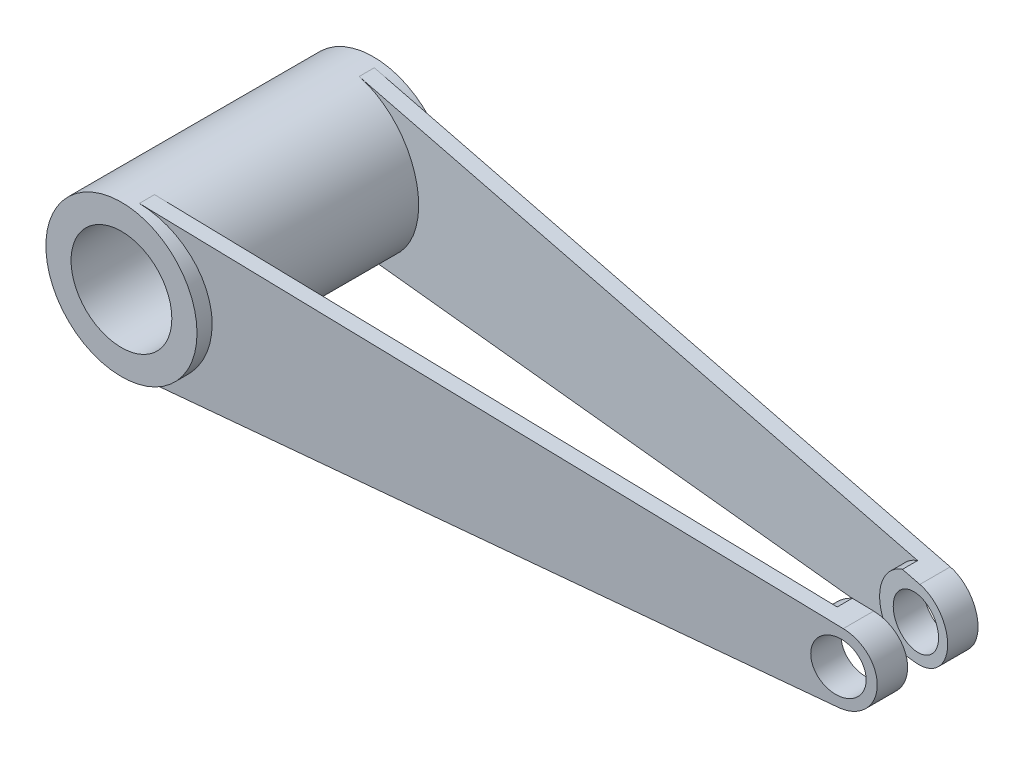
ISO-10303-21;
HEADER;
FILE_DESCRIPTION(('STEP AP214'),'2;1');
FILE_NAME('part.step','',(''),(''),'','','');
FILE_SCHEMA(('AUTOMOTIVE_DESIGN { 1 0 10303 214 1 1 1 1 }'));
ENDSEC;
DATA;
#1=APPLICATION_CONTEXT('core data for automotive mechanical design processes');
#2=APPLICATION_PROTOCOL_DEFINITION('international standard','automotive_design',2000,#1);
#3=PRODUCT_CONTEXT('',#1,'mechanical');
#4=PRODUCT('Part','Part','',(#3));
#5=PRODUCT_RELATED_PRODUCT_CATEGORY('part','',(#4));
#6=PRODUCT_DEFINITION_FORMATION('','',#4);
#7=PRODUCT_DEFINITION_CONTEXT('part definition',#1,'design');
#8=PRODUCT_DEFINITION('design','',#6,#7);
#9=PRODUCT_DEFINITION_SHAPE('','',#8);
#10=(LENGTH_UNIT() NAMED_UNIT(*) SI_UNIT(.MILLI.,.METRE.));
#11=(NAMED_UNIT(*) PLANE_ANGLE_UNIT() SI_UNIT($,.RADIAN.));
#12=(NAMED_UNIT(*) SI_UNIT($,.STERADIAN.) SOLID_ANGLE_UNIT());
#13=UNCERTAINTY_MEASURE_WITH_UNIT(LENGTH_MEASURE(1.E-05),#10,'distance_accuracy_value','');
#14=(GEOMETRIC_REPRESENTATION_CONTEXT(3) GLOBAL_UNCERTAINTY_ASSIGNED_CONTEXT((#13)) GLOBAL_UNIT_ASSIGNED_CONTEXT((#10,
#11,#12)) REPRESENTATION_CONTEXT('',''));
#15=CARTESIAN_POINT('',(0.,0.,0.));
#16=DIRECTION('',(0.,0.,1.));
#17=DIRECTION('',(1.,0.,0.));
#18=AXIS2_PLACEMENT_3D('',#15,#16,#17);
#19=CARTESIAN_POINT('',(0.,0.,0.));
#20=DIRECTION('',(0.,1.,0.));
#21=DIRECTION('',(0.,0.,1.));
#22=AXIS2_PLACEMENT_3D('',#19,#20,#21);
#23=PLANE('',#22);
#24=DIRECTION('',(-0.995037190209989,0.,-0.0995037190209985));
#25=VECTOR('',#24,1.);
#26=CARTESIAN_POINT('',(154.700746273275,0.,-3.50000000000005));
#27=LINE('',#26,#25);
#28=CARTESIAN_POINT('',(143.,0.,-4.67007462732751));
#29=VERTEX_POINT('',#28);
#30=CARTESIAN_POINT('',(139.127016653793,0.,-5.05737296194825));
#31=VERTEX_POINT('',#30);
#32=EDGE_CURVE('E242',#29,#31,#27,.T.);
#33=ORIENTED_EDGE('',*,*,#32,.T.);
#34=DIRECTION('',(0.,0.,1.));
#35=VECTOR('',#34,1.);
#36=CARTESIAN_POINT('',(139.127016653793,0.,-25.));
#37=LINE('',#36,#35);
#38=CARTESIAN_POINT('',(139.127016653793,0.,-8.07233564828452));
#39=VERTEX_POINT('',#38);
#40=EDGE_CURVE('E306',#39,#31,#37,.T.);
#41=ORIENTED_EDGE('',*,*,#40,.F.);
#42=DIRECTION('',(-0.995037190209989,0.,-0.0995037190209987));
#43=VECTOR('',#42,1.);
#44=CARTESIAN_POINT('',(149.701488842937,0.,-7.01488842937008));
#45=LINE('',#44,#43);
#46=CARTESIAN_POINT('',(15.,0.,-20.4850373136637));
#47=VERTEX_POINT('',#46);
#48=EDGE_CURVE('E358',#39,#47,#45,.T.);
#49=ORIENTED_EDGE('',*,*,#48,.T.);
#50=DIRECTION('',(0.,0.,1.));
#51=VECTOR('',#50,1.);
#52=CARTESIAN_POINT('',(15.,0.,-25.));
#53=LINE('',#52,#51);
#54=CARTESIAN_POINT('',(15.,0.,-23.5));
#55=VERTEX_POINT('',#54);
#56=EDGE_CURVE('E265',#47,#55,#53,.F.);
#57=ORIENTED_EDGE('',*,*,#56,.T.);
#58=DIRECTION('',(-0.995037190209989,0.,-0.0995037190209986));
#59=VECTOR('',#58,1.);
#60=CARTESIAN_POINT('',(150.,0.,-10.));
#61=LINE('',#60,#59);
#62=CARTESIAN_POINT('',(143.,0.,-10.7));
#63=VERTEX_POINT('',#62);
#64=EDGE_CURVE('E264',#63,#55,#61,.T.);
#65=ORIENTED_EDGE('',*,*,#64,.F.);
#66=DIRECTION('',(0.,0.,1.));
#67=VECTOR('',#66,1.);
#68=CARTESIAN_POINT('',(143.,0.,-25.));
#69=LINE('',#68,#67);
#70=EDGE_CURVE('E256',#63,#29,#69,.T.);
#71=ORIENTED_EDGE('',*,*,#70,.T.);
#72=EDGE_LOOP('',(#33,#41,#49,#57,#65,#71));
#73=FACE_BOUND('',#72,.T.);
#74=ADVANCED_FACE('F155',(#73),#23,.F.);
#75=DIRECTION('',(0.995037190209989,0.,-0.0995037190209992));
#76=VECTOR('',#75,1.);
#77=CARTESIAN_POINT('',(154.700746273275,0.,3.49999999999995));
#78=LINE('',#77,#76);
#79=CARTESIAN_POINT('',(139.127016653793,0.,5.05737296194816));
#80=VERTEX_POINT('',#79);
#81=CARTESIAN_POINT('',(143.,0.,4.67007462732742));
#82=VERTEX_POINT('',#81);
#83=EDGE_CURVE('E251',#80,#82,#78,.T.);
#84=ORIENTED_EDGE('',*,*,#83,.T.);
#85=CARTESIAN_POINT('',(143.,0.,10.7));
#86=VERTEX_POINT('',#85);
#87=EDGE_CURVE('E266',#82,#86,#69,.T.);
#88=ORIENTED_EDGE('',*,*,#87,.T.);
#89=DIRECTION('',(0.995037190209989,0.,-0.0995037190209992));
#90=VECTOR('',#89,1.);
#91=CARTESIAN_POINT('',(0.,0.,25.));
#92=LINE('',#91,#90);
#93=CARTESIAN_POINT('',(15.,0.,23.5));
#94=VERTEX_POINT('',#93);
#95=EDGE_CURVE('E326',#94,#86,#92,.T.);
#96=ORIENTED_EDGE('',*,*,#95,.F.);
#97=CARTESIAN_POINT('',(15.,0.,20.4850373136637));
#98=VERTEX_POINT('',#97);
#99=EDGE_CURVE('E268',#94,#98,#53,.F.);
#100=ORIENTED_EDGE('',*,*,#99,.T.);
#101=DIRECTION('',(0.995037190209989,0.,-0.0995037190209992));
#102=VECTOR('',#101,1.);
#103=CARTESIAN_POINT('',(-0.298511157062994,0.,22.01488842937));
#104=LINE('',#103,#102);
#105=CARTESIAN_POINT('',(139.127016653793,0.,8.07233564828443));
#106=VERTEX_POINT('',#105);
#107=EDGE_CURVE('E305',#98,#106,#104,.T.);
#108=ORIENTED_EDGE('',*,*,#107,.T.);
#109=EDGE_CURVE('E289',#80,#106,#37,.T.);
#110=ORIENTED_EDGE('',*,*,#109,.F.);
#111=EDGE_LOOP('',(#84,#88,#96,#100,#108,#110));
#112=FACE_BOUND('',#111,.T.);
#113=ADVANCED_FACE('F304',(#112),#23,.F.);
#114=CARTESIAN_POINT('',(143.,7.,-25.));
#115=DIRECTION('',(0.,0.,1.));
#116=DIRECTION('',(1.,0.,0.));
#117=AXIS2_PLACEMENT_3D('',#114,#115,#116);
#118=CYLINDRICAL_SURFACE('',#117,7.00000000000002);
#119=DIRECTION('',(0.,0.,1.));
#120=VECTOR('',#119,1.);
#121=CARTESIAN_POINT('',(143.871595330739,13.9455252918288,-25.));
#122=LINE('',#121,#120);
#123=CARTESIAN_POINT('',(143.871595330739,13.9455252918288,-10.6128404669261));
#124=VERTEX_POINT('',#123);
#125=CARTESIAN_POINT('',(143.871595330739,13.9455252918288,-4.58291509425358));
#126=VERTEX_POINT('',#125);
#127=EDGE_CURVE('E259',#124,#126,#122,.T.);
#128=ORIENTED_EDGE('',*,*,#127,.T.);
#129=CARTESIAN_POINT('',(143.,7.,-4.67007462732751));
#130=DIRECTION('',(-0.0995037190209985,0.,0.995037190209989));
#131=DIRECTION('',(0.995037190209989,0.,0.0995037190209985));
#132=AXIS2_PLACEMENT_3D('',#129,#130,#131);
#133=ELLIPSE('',#132,7.03491293478464,7.00000000000002);
#134=EDGE_CURVE('E246',#126,#29,#133,.F.);
#135=ORIENTED_EDGE('',*,*,#134,.T.);
#136=ORIENTED_EDGE('',*,*,#70,.F.);
#137=CARTESIAN_POINT('',(143.,7.,-10.7));
#138=DIRECTION('',(-0.0995037190209986,0.,0.995037190209989));
#139=DIRECTION('',(0.995037190209989,0.,0.0995037190209987));
#140=AXIS2_PLACEMENT_3D('',#137,#138,#139);
#141=ELLIPSE('',#140,7.03491293478464,7.00000000000002);
#142=EDGE_CURVE('E321',#63,#124,#141,.T.);
#143=ORIENTED_EDGE('',*,*,#142,.T.);
#144=EDGE_LOOP('',(#128,#135,#136,#143));
#145=FACE_BOUND('',#144,.T.);
#146=ADVANCED_FACE('F255',(#145),#118,.T.);
#147=ORIENTED_EDGE('',*,*,#87,.F.);
#148=CARTESIAN_POINT('',(143.,7.,4.67007462732742));
#149=DIRECTION('',(-0.0995037190209991,0.,-0.995037190209989));
#150=DIRECTION('',(-0.995037190209989,0.,0.0995037190209992));
#151=AXIS2_PLACEMENT_3D('',#148,#149,#150);
#152=ELLIPSE('',#151,7.03491293478464,7.00000000000002);
#153=CARTESIAN_POINT('',(143.871595330739,13.9455252918288,4.5829150942535));
#154=VERTEX_POINT('',#153);
#155=EDGE_CURVE('E298',#82,#154,#152,.F.);
#156=ORIENTED_EDGE('',*,*,#155,.T.);
#157=CARTESIAN_POINT('',(143.871595330739,13.9455252918288,10.612840466926));
#158=VERTEX_POINT('',#157);
#159=EDGE_CURVE('E316',#154,#158,#122,.T.);
#160=ORIENTED_EDGE('',*,*,#159,.T.);
#161=CARTESIAN_POINT('',(143.,7.,10.7));
#162=DIRECTION('',(-0.0995037190209992,0.,-0.995037190209989));
#163=DIRECTION('',(-0.995037190209989,0.,0.0995037190209992));
#164=AXIS2_PLACEMENT_3D('',#161,#162,#163);
#165=ELLIPSE('',#164,7.03491293478464,7.00000000000002);
#166=EDGE_CURVE('E279',#158,#86,#165,.T.);
#167=ORIENTED_EDGE('',*,*,#166,.T.);
#168=EDGE_LOOP('',(#147,#156,#160,#167));
#169=FACE_BOUND('',#168,.T.);
#170=ADVANCED_FACE('F424',(#169),#118,.T.);
#171=CARTESIAN_POINT('',(143.,7.,-25.));
#172=DIRECTION('',(0.,0.,1.));
#173=DIRECTION('',(1.,0.,0.));
#174=AXIS2_PLACEMENT_3D('',#171,#172,#173);
#175=CYLINDRICAL_SURFACE('',#174,5.00000000000002);
#176=CARTESIAN_POINT('',(143.,7.,-10.7));
#177=DIRECTION('',(-0.0995037190209986,0.,0.995037190209989));
#178=DIRECTION('',(0.995037190209989,0.,0.0995037190209987));
#179=AXIS2_PLACEMENT_3D('',#176,#177,#178);
#180=ELLIPSE('',#179,5.02493781056046,5.00000000000002);
#181=CARTESIAN_POINT('',(148.,7.,-10.2));
#182=VERTEX_POINT('',#181);
#183=EDGE_CURVE('E275',#182,#182,#180,.T.);
#184=ORIENTED_EDGE('',*,*,#183,.F.);
#185=EDGE_LOOP('',(#184));
#186=FACE_BOUND('',#185,.T.);
#187=CARTESIAN_POINT('',(143.,7.,-4.67007462732751));
#188=DIRECTION('',(-0.0995037190209985,0.,0.995037190209989));
#189=DIRECTION('',(0.995037190209989,0.,0.0995037190209985));
#190=AXIS2_PLACEMENT_3D('',#187,#188,#189);
#191=ELLIPSE('',#190,5.02493781056046,5.00000000000002);
#192=CARTESIAN_POINT('',(148.,7.,-4.17007462732751));
#193=VERTEX_POINT('',#192);
#194=EDGE_CURVE('E260',#193,#193,#191,.F.);
#195=ORIENTED_EDGE('',*,*,#194,.F.);
#196=EDGE_LOOP('',(#195));
#197=FACE_BOUND('',#196,.T.);
#198=ADVANCED_FACE('F409',(#186,#197),#175,.F.);
#199=CARTESIAN_POINT('',(143.,7.,10.7));
#200=DIRECTION('',(-0.0995037190209992,0.,-0.995037190209989));
#201=DIRECTION('',(-0.995037190209989,0.,0.0995037190209992));
#202=AXIS2_PLACEMENT_3D('',#199,#200,#201);
#203=ELLIPSE('',#202,5.02493781056046,5.00000000000002);
#204=CARTESIAN_POINT('',(138.,7.,11.2));
#205=VERTEX_POINT('',#204);
#206=EDGE_CURVE('E278',#205,#205,#203,.T.);
#207=ORIENTED_EDGE('',*,*,#206,.F.);
#208=EDGE_LOOP('',(#207));
#209=FACE_BOUND('',#208,.T.);
#210=CARTESIAN_POINT('',(143.,7.,4.67007462732742));
#211=DIRECTION('',(-0.0995037190209991,0.,-0.995037190209989));
#212=DIRECTION('',(-0.995037190209989,0.,0.0995037190209992));
#213=AXIS2_PLACEMENT_3D('',#210,#211,#212);
#214=ELLIPSE('',#213,5.02493781056046,5.00000000000002);
#215=CARTESIAN_POINT('',(138.,7.,5.17007462732743));
#216=VERTEX_POINT('',#215);
#217=EDGE_CURVE('E370',#216,#216,#214,.F.);
#218=ORIENTED_EDGE('',*,*,#217,.F.);
#219=EDGE_LOOP('',(#218));
#220=FACE_BOUND('',#219,.T.);
#221=ADVANCED_FACE('F423',(#209,#220),#175,.F.);
#222=CARTESIAN_POINT('',(3.95342851519326,31.5038834804463,-25.));
#223=DIRECTION('',(-0.124513618677043,-0.992217898832685,0.));
#224=DIRECTION('',(0.992217898832685,-0.124513618677043,0.));
#225=AXIS2_PLACEMENT_3D('',#222,#223,#224);
#226=PLANE('',#225);
#227=DIRECTION('',(-0.987369494337939,0.123905191446329,-0.0987369494337935));
#228=VECTOR('',#227,1.);
#229=CARTESIAN_POINT('',(3.3270300680172,31.5824903444057,-18.6373716205257));
#230=LINE('',#229,#228);
#231=CARTESIAN_POINT('',(140.028751932751,14.427764463341,-4.96719943405237));
#232=VERTEX_POINT('',#231);
#233=EDGE_CURVE('E170',#126,#232,#230,.T.);
#234=ORIENTED_EDGE('',*,*,#233,.F.);
#235=ORIENTED_EDGE('',*,*,#127,.F.);
#236=DIRECTION('',(0.987369494337939,-0.123905191446329,0.0987369494337936));
#237=VECTOR('',#236,1.);
#238=CARTESIAN_POINT('',(144.271599755619,13.8953286581184,-10.5728400244381));
#239=LINE('',#238,#237);
#240=CARTESIAN_POINT('',(16.8677042801556,29.8832684824903,-23.3132295719844));
#241=VERTEX_POINT('',#240);
#242=EDGE_CURVE('E274',#241,#124,#239,.T.);
#243=ORIENTED_EDGE('',*,*,#242,.F.);
#244=DIRECTION('',(0.,0.,1.));
#245=VECTOR('',#244,1.);
#246=CARTESIAN_POINT('',(16.8677042801556,29.8832684824903,-25.));
#247=LINE('',#246,#245);
#248=CARTESIAN_POINT('',(16.8677042801556,29.8832684824903,-20.2982668856482));
#249=VERTEX_POINT('',#248);
#250=EDGE_CURVE('E317',#241,#249,#247,.T.);
#251=ORIENTED_EDGE('',*,*,#250,.T.);
#252=DIRECTION('',(0.987369494337939,-0.123905191446329,0.0987369494337936));
#253=VECTOR('',#252,1.);
#254=CARTESIAN_POINT('',(143.977671490041,13.9322137737988,-7.5872701646597));
#255=LINE('',#254,#253);
#256=CARTESIAN_POINT('',(140.028751932751,14.427764463341,-7.98216212038864));
#257=VERTEX_POINT('',#256);
#258=EDGE_CURVE('E360',#249,#257,#255,.T.);
#259=ORIENTED_EDGE('',*,*,#258,.T.);
#260=DIRECTION('',(0.,0.,1.));
#261=VECTOR('',#260,1.);
#262=CARTESIAN_POINT('',(140.028751932751,14.427764463341,-25.));
#263=LINE('',#262,#261);
#264=EDGE_CURVE('E307',#257,#232,#263,.T.);
#265=ORIENTED_EDGE('',*,*,#264,.T.);
#266=EDGE_LOOP('',(#234,#235,#243,#251,#259,#265));
#267=FACE_BOUND('',#266,.T.);
#268=ADVANCED_FACE('F369',(#267),#226,.F.);
#269=DIRECTION('',(0.987369494337939,-0.123905191446329,-0.0987369494337941));
#270=VECTOR('',#269,1.);
#271=CARTESIAN_POINT('',(8.20152265976299,30.9707893132846,18.1499223613512));
#272=LINE('',#271,#270);
#273=CARTESIAN_POINT('',(140.028751932751,14.427764463341,4.96719943405228));
#274=VERTEX_POINT('',#273);
#275=EDGE_CURVE('E301',#274,#154,#272,.T.);
#276=ORIENTED_EDGE('',*,*,#275,.F.);
#277=CARTESIAN_POINT('',(140.028751932751,14.427764463341,7.98216212038855));
#278=VERTEX_POINT('',#277);
#279=EDGE_CURVE('E291',#274,#278,#263,.T.);
#280=ORIENTED_EDGE('',*,*,#279,.T.);
#281=DIRECTION('',(-0.987369494337939,0.123905191446329,0.0987369494337942));
#282=VECTOR('',#281,1.);
#283=CARTESIAN_POINT('',(-3.71945403985654,32.4667550167663,22.3569827176494));
#284=LINE('',#283,#282);
#285=CARTESIAN_POINT('',(16.8677042801556,29.8832684824903,20.2982668856482));
#286=VERTEX_POINT('',#285);
#287=EDGE_CURVE('E352',#278,#286,#284,.T.);
#288=ORIENTED_EDGE('',*,*,#287,.T.);
#289=CARTESIAN_POINT('',(16.8677042801556,29.8832684824903,23.3132295719844));
#290=VERTEX_POINT('',#289);
#291=EDGE_CURVE('E309',#286,#290,#247,.T.);
#292=ORIENTED_EDGE('',*,*,#291,.T.);
#293=DIRECTION('',(-0.987369494337939,0.123905191446329,0.0987369494337942));
#294=VECTOR('',#293,1.);
#295=CARTESIAN_POINT('',(-3.42552577427781,32.4298699010858,25.3425525774278));
#296=LINE('',#295,#294);
#297=EDGE_CURVE('E315',#158,#290,#296,.T.);
#298=ORIENTED_EDGE('',*,*,#297,.F.);
#299=ORIENTED_EDGE('',*,*,#159,.F.);
#300=EDGE_LOOP('',(#276,#280,#288,#292,#298,#299));
#301=FACE_BOUND('',#300,.T.);
#302=ADVANCED_FACE('F453',(#301),#226,.F.);
#303=CARTESIAN_POINT('',(143.,7.,-25.));
#304=DIRECTION('',(0.,0.,1.));
#305=DIRECTION('',(1.,0.,0.));
#306=AXIS2_PLACEMENT_3D('',#303,#304,#305);
#307=CYLINDRICAL_SURFACE('',#306,8.00000000000002);
#308=ORIENTED_EDGE('',*,*,#40,.T.);
#309=CARTESIAN_POINT('',(143.,7.,-4.67007462732751));
#310=DIRECTION('',(-0.0995037190209985,0.,0.995037190209989));
#311=DIRECTION('',(0.995037190209989,0.,0.0995037190209985));
#312=AXIS2_PLACEMENT_3D('',#309,#310,#311);
#313=ELLIPSE('',#312,8.03990049689673,8.00000000000002);
#314=EDGE_CURVE('E12',#31,#232,#313,.F.);
#315=ORIENTED_EDGE('',*,*,#314,.T.);
#316=ORIENTED_EDGE('',*,*,#264,.F.);
#317=CARTESIAN_POINT('',(143.,7.,-7.68503731366378));
#318=DIRECTION('',(-0.0995037190209986,0.,0.995037190209989));
#319=DIRECTION('',(0.995037190209989,0.,0.0995037190209987));
#320=AXIS2_PLACEMENT_3D('',#317,#318,#319);
#321=ELLIPSE('',#320,8.03990049689673,8.00000000000002);
#322=EDGE_CURVE('E355',#257,#39,#321,.T.);
#323=ORIENTED_EDGE('',*,*,#322,.T.);
#324=EDGE_LOOP('',(#308,#315,#316,#323));
#325=FACE_BOUND('',#324,.T.);
#326=ADVANCED_FACE('F443',(#325),#307,.T.);
#327=CARTESIAN_POINT('',(143.,7.,4.67007462732742));
#328=DIRECTION('',(-0.0995037190209991,0.,-0.995037190209989));
#329=DIRECTION('',(-0.995037190209989,0.,0.0995037190209992));
#330=AXIS2_PLACEMENT_3D('',#327,#328,#329);
#331=ELLIPSE('',#330,8.03990049689673,8.00000000000002);
#332=EDGE_CURVE('E163',#274,#80,#331,.F.);
#333=ORIENTED_EDGE('',*,*,#332,.T.);
#334=ORIENTED_EDGE('',*,*,#109,.T.);
#335=CARTESIAN_POINT('',(143.,7.,7.68503731366368));
#336=DIRECTION('',(-0.0995037190209992,0.,-0.995037190209989));
#337=DIRECTION('',(-0.995037190209989,0.,0.0995037190209992));
#338=AXIS2_PLACEMENT_3D('',#335,#336,#337);
#339=ELLIPSE('',#338,8.03990049689673,8.00000000000002);
#340=EDGE_CURVE('E353',#106,#278,#339,.T.);
#341=ORIENTED_EDGE('',*,*,#340,.T.);
#342=ORIENTED_EDGE('',*,*,#279,.F.);
#343=EDGE_LOOP('',(#333,#334,#341,#342));
#344=FACE_BOUND('',#343,.T.);
#345=ADVANCED_FACE('F286',(#344),#307,.T.);
#346=CARTESIAN_POINT('',(0.,60.,25.));
#347=DIRECTION('',(-0.0995037190209992,0.,-0.995037190209989));
#348=DIRECTION('',(-0.995037190209989,0.,0.0995037190209992));
#349=AXIS2_PLACEMENT_3D('',#346,#347,#348);
#350=PLANE('',#349);
#351=ORIENTED_EDGE('',*,*,#206,.T.);
#352=EDGE_LOOP('',(#351));
#353=FACE_BOUND('',#352,.T.);
#354=CARTESIAN_POINT('',(15.,15.,23.5));
#355=DIRECTION('',(-0.0995037190209992,0.,-0.995037190209989));
#356=DIRECTION('',(0.995037190209989,0.,-0.0995037190209992));
#357=AXIS2_PLACEMENT_3D('',#354,#355,#356);
#358=ELLIPSE('',#357,15.0748134316813,15.);
#359=EDGE_CURVE('E343',#94,#290,#358,.F.);
#360=ORIENTED_EDGE('',*,*,#359,.F.);
#361=ORIENTED_EDGE('',*,*,#95,.T.);
#362=ORIENTED_EDGE('',*,*,#166,.F.);
#363=ORIENTED_EDGE('',*,*,#297,.T.);
#364=EDGE_LOOP('',(#360,#361,#362,#363));
#365=FACE_BOUND('',#364,.T.);
#366=ADVANCED_FACE('F157',(#353,#365),#350,.F.);
#367=CARTESIAN_POINT('',(150.,60.,-10.));
#368=DIRECTION('',(-0.0995037190209986,0.,0.995037190209989));
#369=DIRECTION('',(0.995037190209989,0.,0.0995037190209987));
#370=AXIS2_PLACEMENT_3D('',#367,#368,#369);
#371=PLANE('',#370);
#372=ORIENTED_EDGE('',*,*,#183,.T.);
#373=EDGE_LOOP('',(#372));
#374=FACE_BOUND('',#373,.T.);
#375=CARTESIAN_POINT('',(15.,15.,-23.5));
#376=DIRECTION('',(-0.0995037190209986,0.,0.995037190209989));
#377=DIRECTION('',(-0.995037190209989,0.,-0.0995037190209987));
#378=AXIS2_PLACEMENT_3D('',#375,#376,#377);
#379=ELLIPSE('',#378,15.0748134316813,15.);
#380=EDGE_CURVE('E334',#241,#55,#379,.F.);
#381=ORIENTED_EDGE('',*,*,#380,.F.);
#382=ORIENTED_EDGE('',*,*,#242,.T.);
#383=ORIENTED_EDGE('',*,*,#142,.F.);
#384=ORIENTED_EDGE('',*,*,#64,.T.);
#385=EDGE_LOOP('',(#381,#382,#383,#384));
#386=FACE_BOUND('',#385,.T.);
#387=ADVANCED_FACE('F333',(#374,#386),#371,.F.);
#388=CARTESIAN_POINT('',(149.701488842937,60.,-7.01488842937008));
#389=DIRECTION('',(-0.0995037190209986,0.,0.995037190209989));
#390=DIRECTION('',(0.995037190209989,0.,0.0995037190209987));
#391=AXIS2_PLACEMENT_3D('',#388,#389,#390);
#392=PLANE('',#391);
#393=ORIENTED_EDGE('',*,*,#258,.F.);
#394=CARTESIAN_POINT('',(15.,15.,-20.4850373136637));
#395=DIRECTION('',(-0.0995037190209986,0.,0.995037190209989));
#396=DIRECTION('',(-0.995037190209989,0.,-0.0995037190209987));
#397=AXIS2_PLACEMENT_3D('',#394,#395,#396);
#398=ELLIPSE('',#397,15.0748134316813,15.);
#399=EDGE_CURVE('E282',#249,#47,#398,.F.);
#400=ORIENTED_EDGE('',*,*,#399,.T.);
#401=ORIENTED_EDGE('',*,*,#48,.F.);
#402=ORIENTED_EDGE('',*,*,#322,.F.);
#403=EDGE_LOOP('',(#393,#400,#401,#402));
#404=FACE_BOUND('',#403,.T.);
#405=ADVANCED_FACE('F367',(#404),#392,.T.);
#406=CARTESIAN_POINT('',(15.,15.,-25.));
#407=DIRECTION('',(0.,0.,1.));
#408=DIRECTION('',(1.,0.,0.));
#409=AXIS2_PLACEMENT_3D('',#406,#407,#408);
#410=CYLINDRICAL_SURFACE('',#409,15.);
#411=ORIENTED_EDGE('',*,*,#99,.F.);
#412=ORIENTED_EDGE('',*,*,#359,.T.);
#413=ORIENTED_EDGE('',*,*,#291,.F.);
#414=CARTESIAN_POINT('',(15.,15.,20.4850373136637));
#415=DIRECTION('',(-0.0995037190209992,0.,-0.995037190209989));
#416=DIRECTION('',(0.995037190209989,0.,-0.0995037190209992));
#417=AXIS2_PLACEMENT_3D('',#414,#415,#416);
#418=ELLIPSE('',#417,15.0748134316813,15.);
#419=EDGE_CURVE('E177',#98,#286,#418,.F.);
#420=ORIENTED_EDGE('',*,*,#419,.F.);
#421=EDGE_LOOP('',(#411,#412,#413,#420));
#422=FACE_BOUND('',#421,.T.);
#423=ORIENTED_EDGE('',*,*,#250,.F.);
#424=ORIENTED_EDGE('',*,*,#380,.T.);
#425=ORIENTED_EDGE('',*,*,#56,.F.);
#426=ORIENTED_EDGE('',*,*,#399,.F.);
#427=EDGE_LOOP('',(#423,#424,#425,#426));
#428=FACE_BOUND('',#427,.T.);
#429=CARTESIAN_POINT('',(15.,15.,-25.));
#430=DIRECTION('',(0.,0.,1.));
#431=DIRECTION('',(1.,0.,0.));
#432=AXIS2_PLACEMENT_3D('',#429,#430,#431);
#433=CIRCLE('',#432,15.);
#434=CARTESIAN_POINT('',(30.,15.,-25.));
#435=VERTEX_POINT('',#434);
#436=EDGE_CURVE('E346',#435,#435,#433,.T.);
#437=ORIENTED_EDGE('',*,*,#436,.T.);
#438=EDGE_LOOP('',(#437));
#439=FACE_BOUND('',#438,.T.);
#440=CARTESIAN_POINT('',(15.,15.,25.));
#441=DIRECTION('',(0.,0.,1.));
#442=DIRECTION('',(1.,0.,0.));
#443=AXIS2_PLACEMENT_3D('',#440,#441,#442);
#444=CIRCLE('',#443,15.);
#445=CARTESIAN_POINT('',(30.,15.,25.));
#446=VERTEX_POINT('',#445);
#447=EDGE_CURVE('E341',#446,#446,#444,.T.);
#448=ORIENTED_EDGE('',*,*,#447,.F.);
#449=EDGE_LOOP('',(#448));
#450=FACE_BOUND('',#449,.T.);
#451=ADVANCED_FACE('F339',(#422,#428,#439,#450),#410,.T.);
#452=CARTESIAN_POINT('',(-0.298511157062994,60.,22.01488842937));
#453=DIRECTION('',(-0.0995037190209992,0.,-0.995037190209989));
#454=DIRECTION('',(-0.995037190209989,0.,0.0995037190209992));
#455=AXIS2_PLACEMENT_3D('',#452,#453,#454);
#456=PLANE('',#455);
#457=ORIENTED_EDGE('',*,*,#107,.F.);
#458=ORIENTED_EDGE('',*,*,#419,.T.);
#459=ORIENTED_EDGE('',*,*,#287,.F.);
#460=ORIENTED_EDGE('',*,*,#340,.F.);
#461=EDGE_LOOP('',(#457,#458,#459,#460));
#462=FACE_BOUND('',#461,.T.);
#463=ADVANCED_FACE('F540',(#462),#456,.T.);
#464=CARTESIAN_POINT('',(15.,15.,-25.));
#465=DIRECTION('',(0.,0.,1.));
#466=DIRECTION('',(1.,0.,0.));
#467=AXIS2_PLACEMENT_3D('',#464,#465,#466);
#468=PLANE('',#467);
#469=ORIENTED_EDGE('',*,*,#436,.F.);
#470=EDGE_LOOP('',(#469));
#471=FACE_BOUND('',#470,.T.);
#472=CARTESIAN_POINT('',(15.,15.,-25.));
#473=DIRECTION('',(0.,0.,1.));
#474=DIRECTION('',(1.,0.,0.));
#475=AXIS2_PLACEMENT_3D('',#472,#473,#474);
#476=CIRCLE('',#475,10.);
#477=CARTESIAN_POINT('',(25.,15.,-25.));
#478=VERTEX_POINT('',#477);
#479=EDGE_CURVE('E378',#478,#478,#476,.T.);
#480=ORIENTED_EDGE('',*,*,#479,.T.);
#481=EDGE_LOOP('',(#480));
#482=FACE_BOUND('',#481,.T.);
#483=ADVANCED_FACE('F385',(#471,#482),#468,.F.);
#484=CARTESIAN_POINT('',(15.,15.,-25.));
#485=DIRECTION('',(0.,0.,1.));
#486=DIRECTION('',(1.,0.,0.));
#487=AXIS2_PLACEMENT_3D('',#484,#485,#486);
#488=CYLINDRICAL_SURFACE('',#487,9.99999999999999);
#489=ORIENTED_EDGE('',*,*,#479,.F.);
#490=EDGE_LOOP('',(#489));
#491=FACE_BOUND('',#490,.T.);
#492=CARTESIAN_POINT('',(15.,15.,25.));
#493=DIRECTION('',(0.,0.,1.));
#494=DIRECTION('',(1.,0.,0.));
#495=AXIS2_PLACEMENT_3D('',#492,#493,#494);
#496=CIRCLE('',#495,10.);
#497=CARTESIAN_POINT('',(25.,15.,25.));
#498=VERTEX_POINT('',#497);
#499=EDGE_CURVE('E379',#498,#498,#496,.T.);
#500=ORIENTED_EDGE('',*,*,#499,.T.);
#501=EDGE_LOOP('',(#500));
#502=FACE_BOUND('',#501,.T.);
#503=ADVANCED_FACE('F387',(#491,#502),#488,.F.);
#504=CARTESIAN_POINT('',(15.,15.,25.));
#505=DIRECTION('',(0.,0.,1.));
#506=DIRECTION('',(1.,0.,0.));
#507=AXIS2_PLACEMENT_3D('',#504,#505,#506);
#508=PLANE('',#507);
#509=ORIENTED_EDGE('',*,*,#447,.T.);
#510=EDGE_LOOP('',(#509));
#511=FACE_BOUND('',#510,.T.);
#512=ORIENTED_EDGE('',*,*,#499,.F.);
#513=EDGE_LOOP('',(#512));
#514=FACE_BOUND('',#513,.T.);
#515=ADVANCED_FACE('F390',(#511,#514),#508,.T.);
#516=CARTESIAN_POINT('',(154.700746273275,20.,3.49999999999995));
#517=DIRECTION('',(-0.0995037190209991,0.,-0.995037190209989));
#518=DIRECTION('',(-0.995037190209989,0.,0.0995037190209992));
#519=AXIS2_PLACEMENT_3D('',#516,#517,#518);
#520=PLANE('',#519);
#521=ORIENTED_EDGE('',*,*,#83,.F.);
#522=ORIENTED_EDGE('',*,*,#332,.F.);
#523=ORIENTED_EDGE('',*,*,#275,.T.);
#524=ORIENTED_EDGE('',*,*,#155,.F.);
#525=EDGE_LOOP('',(#521,#522,#523,#524));
#526=FACE_BOUND('',#525,.T.);
#527=ORIENTED_EDGE('',*,*,#217,.T.);
#528=EDGE_LOOP('',(#527));
#529=FACE_BOUND('',#528,.T.);
#530=ADVANCED_FACE('F295',(#526,#529),#520,.T.);
#531=CARTESIAN_POINT('',(154.700746273275,20.,-3.50000000000005));
#532=DIRECTION('',(-0.0995037190209985,0.,0.995037190209989));
#533=DIRECTION('',(0.995037190209989,0.,0.0995037190209985));
#534=AXIS2_PLACEMENT_3D('',#531,#532,#533);
#535=PLANE('',#534);
#536=ORIENTED_EDGE('',*,*,#233,.T.);
#537=ORIENTED_EDGE('',*,*,#314,.F.);
#538=ORIENTED_EDGE('',*,*,#32,.F.);
#539=ORIENTED_EDGE('',*,*,#134,.F.);
#540=EDGE_LOOP('',(#536,#537,#538,#539));
#541=FACE_BOUND('',#540,.T.);
#542=ORIENTED_EDGE('',*,*,#194,.T.);
#543=EDGE_LOOP('',(#542));
#544=FACE_BOUND('',#543,.T.);
#545=ADVANCED_FACE('F244',(#541,#544),#535,.T.);
#546=CLOSED_SHELL('',(#74,#113,#146,#170,#198,#221,#268,#302,#326,#345,#366,#387,#405,#451,#463,
#483,#503,#515,#530,#545));
#547=MANIFOLD_SOLID_BREP('B2',#546);
#548=ADVANCED_BREP_SHAPE_REPRESENTATION('',(#18,#547),#14);
#549=SHAPE_DEFINITION_REPRESENTATION(#9,#548);
ENDSEC;
END-ISO-10303-21;
